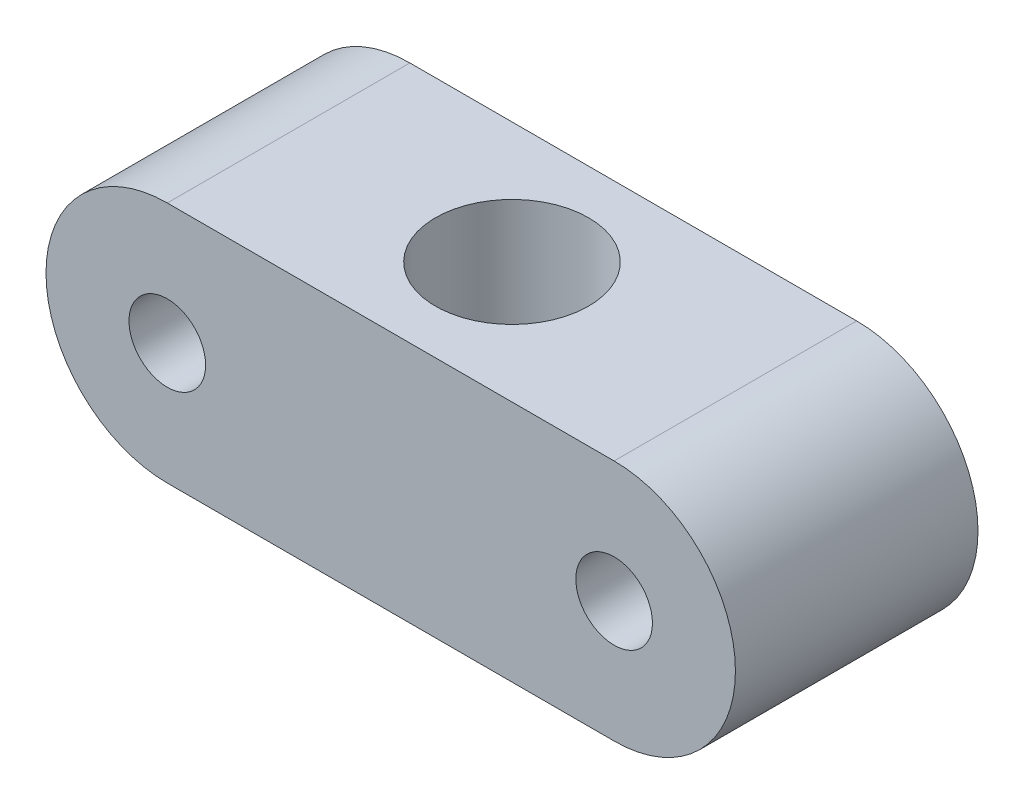
ISO-10303-21;
HEADER;
FILE_DESCRIPTION(('STEP AP214'),'2;1');
FILE_NAME('part.step','',(''),(''),'','','');
FILE_SCHEMA(('AUTOMOTIVE_DESIGN { 1 0 10303 214 1 1 1 1 }'));
ENDSEC;
DATA;
#1=APPLICATION_CONTEXT('core data for automotive mechanical design processes');
#2=APPLICATION_PROTOCOL_DEFINITION('international standard','automotive_design',2000,#1);
#3=PRODUCT_CONTEXT('',#1,'mechanical');
#4=PRODUCT('Part','Part','',(#3));
#5=PRODUCT_RELATED_PRODUCT_CATEGORY('part','',(#4));
#6=PRODUCT_DEFINITION_FORMATION('','',#4);
#7=PRODUCT_DEFINITION_CONTEXT('part definition',#1,'design');
#8=PRODUCT_DEFINITION('design','',#6,#7);
#9=PRODUCT_DEFINITION_SHAPE('','',#8);
#10=(LENGTH_UNIT() NAMED_UNIT(*) SI_UNIT(.MILLI.,.METRE.));
#11=(NAMED_UNIT(*) PLANE_ANGLE_UNIT() SI_UNIT($,.RADIAN.));
#12=(NAMED_UNIT(*) SI_UNIT($,.STERADIAN.) SOLID_ANGLE_UNIT());
#13=UNCERTAINTY_MEASURE_WITH_UNIT(LENGTH_MEASURE(1.E-05),#10,'distance_accuracy_value','');
#14=(GEOMETRIC_REPRESENTATION_CONTEXT(3) GLOBAL_UNCERTAINTY_ASSIGNED_CONTEXT((#13)) GLOBAL_UNIT_ASSIGNED_CONTEXT((#10,
#11,#12)) REPRESENTATION_CONTEXT('',''));
#15=CARTESIAN_POINT('',(0.,0.,0.));
#16=DIRECTION('',(0.,0.,1.));
#17=DIRECTION('',(1.,0.,0.));
#18=AXIS2_PLACEMENT_3D('',#15,#16,#17);
#19=CARTESIAN_POINT('',(0.,0.,19.));
#20=DIRECTION('',(0.,0.,1.));
#21=DIRECTION('',(1.,0.,0.));
#22=AXIS2_PLACEMENT_3D('',#19,#20,#21);
#23=PLANE('',#22);
#24=CARTESIAN_POINT('',(0.,0.,19.));
#25=DIRECTION('',(0.,0.,1.));
#26=DIRECTION('',(1.,0.,0.));
#27=AXIS2_PLACEMENT_3D('',#24,#25,#26);
#28=CIRCLE('',#27,6.);
#29=CARTESIAN_POINT('',(6.00000000000001,0.,19.));
#30=VERTEX_POINT('',#29);
#31=EDGE_CURVE('E102',#30,#30,#28,.T.);
#32=ORIENTED_EDGE('',*,*,#31,.F.);
#33=EDGE_LOOP('',(#32));
#34=FACE_BOUND('',#33,.T.);
#35=CARTESIAN_POINT('',(0.,0.,19.));
#36=DIRECTION('',(0.,0.,1.));
#37=DIRECTION('',(1.,0.,0.));
#38=AXIS2_PLACEMENT_3D('',#35,#36,#37);
#39=CIRCLE('',#38,19.);
#40=CARTESIAN_POINT('',(0.,19.,19.));
#41=VERTEX_POINT('',#40);
#42=CARTESIAN_POINT('',(0.,-19.,19.));
#43=VERTEX_POINT('',#42);
#44=EDGE_CURVE('E87',#41,#43,#39,.T.);
#45=ORIENTED_EDGE('',*,*,#44,.T.);
#46=DIRECTION('',(1.,0.,0.));
#47=VECTOR('',#46,1.);
#48=CARTESIAN_POINT('',(0.,-19.,19.));
#49=LINE('',#48,#47);
#50=CARTESIAN_POINT('',(70.,-19.,19.));
#51=VERTEX_POINT('',#50);
#52=EDGE_CURVE('E82',#43,#51,#49,.T.);
#53=ORIENTED_EDGE('',*,*,#52,.T.);
#54=CARTESIAN_POINT('',(70.,0.,19.));
#55=DIRECTION('',(0.,0.,1.));
#56=DIRECTION('',(1.,0.,0.));
#57=AXIS2_PLACEMENT_3D('',#54,#55,#56);
#58=CIRCLE('',#57,19.);
#59=CARTESIAN_POINT('',(70.,19.,19.));
#60=VERTEX_POINT('',#59);
#61=EDGE_CURVE('E85',#51,#60,#58,.T.);
#62=ORIENTED_EDGE('',*,*,#61,.T.);
#63=DIRECTION('',(-1.,0.,0.));
#64=VECTOR('',#63,1.);
#65=CARTESIAN_POINT('',(0.,19.,19.));
#66=LINE('',#65,#64);
#67=EDGE_CURVE('E52',#60,#41,#66,.T.);
#68=ORIENTED_EDGE('',*,*,#67,.T.);
#69=EDGE_LOOP('',(#45,#53,#62,#68));
#70=FACE_BOUND('',#69,.T.);
#71=CARTESIAN_POINT('',(70.,0.,19.));
#72=DIRECTION('',(0.,0.,1.));
#73=DIRECTION('',(1.,0.,0.));
#74=AXIS2_PLACEMENT_3D('',#71,#72,#73);
#75=CIRCLE('',#74,6.);
#76=CARTESIAN_POINT('',(76.,0.,19.));
#77=VERTEX_POINT('',#76);
#78=EDGE_CURVE('E117',#77,#77,#75,.T.);
#79=ORIENTED_EDGE('',*,*,#78,.F.);
#80=EDGE_LOOP('',(#79));
#81=FACE_BOUND('',#80,.T.);
#82=ADVANCED_FACE('F35',(#34,#70,#81),#23,.T.);
#83=CARTESIAN_POINT('',(0.,0.,-19.));
#84=DIRECTION('',(0.,0.,1.));
#85=DIRECTION('',(1.,0.,0.));
#86=AXIS2_PLACEMENT_3D('',#83,#84,#85);
#87=PLANE('',#86);
#88=CARTESIAN_POINT('',(0.,0.,-19.));
#89=DIRECTION('',(0.,0.,1.));
#90=DIRECTION('',(1.,0.,0.));
#91=AXIS2_PLACEMENT_3D('',#88,#89,#90);
#92=CIRCLE('',#91,19.);
#93=CARTESIAN_POINT('',(0.,19.,-19.));
#94=VERTEX_POINT('',#93);
#95=CARTESIAN_POINT('',(0.,-19.,-19.));
#96=VERTEX_POINT('',#95);
#97=EDGE_CURVE('E99',#94,#96,#92,.T.);
#98=ORIENTED_EDGE('',*,*,#97,.F.);
#99=DIRECTION('',(-1.,0.,0.));
#100=VECTOR('',#99,1.);
#101=CARTESIAN_POINT('',(0.,19.,-19.));
#102=LINE('',#101,#100);
#103=CARTESIAN_POINT('',(70.,19.,-19.));
#104=VERTEX_POINT('',#103);
#105=EDGE_CURVE('E75',#104,#94,#102,.T.);
#106=ORIENTED_EDGE('',*,*,#105,.F.);
#107=CARTESIAN_POINT('',(70.,0.,-19.));
#108=DIRECTION('',(0.,0.,1.));
#109=DIRECTION('',(1.,0.,0.));
#110=AXIS2_PLACEMENT_3D('',#107,#108,#109);
#111=CIRCLE('',#110,19.);
#112=CARTESIAN_POINT('',(70.,-19.,-19.));
#113=VERTEX_POINT('',#112);
#114=EDGE_CURVE('E69',#113,#104,#111,.T.);
#115=ORIENTED_EDGE('',*,*,#114,.F.);
#116=DIRECTION('',(1.,0.,0.));
#117=VECTOR('',#116,1.);
#118=CARTESIAN_POINT('',(0.,-19.,-19.));
#119=LINE('',#118,#117);
#120=EDGE_CURVE('E91',#96,#113,#119,.T.);
#121=ORIENTED_EDGE('',*,*,#120,.F.);
#122=EDGE_LOOP('',(#98,#106,#115,#121));
#123=FACE_BOUND('',#122,.T.);
#124=CARTESIAN_POINT('',(0.,0.,-19.));
#125=DIRECTION('',(0.,0.,1.));
#126=DIRECTION('',(1.,0.,0.));
#127=AXIS2_PLACEMENT_3D('',#124,#125,#126);
#128=CIRCLE('',#127,6.);
#129=CARTESIAN_POINT('',(6.00000000000001,0.,-19.));
#130=VERTEX_POINT('',#129);
#131=EDGE_CURVE('E114',#130,#130,#128,.T.);
#132=ORIENTED_EDGE('',*,*,#131,.T.);
#133=EDGE_LOOP('',(#132));
#134=FACE_BOUND('',#133,.T.);
#135=CARTESIAN_POINT('',(70.,0.,-19.));
#136=DIRECTION('',(0.,0.,1.));
#137=DIRECTION('',(1.,0.,0.));
#138=AXIS2_PLACEMENT_3D('',#135,#136,#137);
#139=CIRCLE('',#138,6.);
#140=CARTESIAN_POINT('',(76.,0.,-19.));
#141=VERTEX_POINT('',#140);
#142=EDGE_CURVE('E120',#141,#141,#139,.T.);
#143=ORIENTED_EDGE('',*,*,#142,.T.);
#144=EDGE_LOOP('',(#143));
#145=FACE_BOUND('',#144,.T.);
#146=ADVANCED_FACE('F110',(#123,#134,#145),#87,.F.);
#147=CARTESIAN_POINT('',(0.,0.,19.));
#148=DIRECTION('',(0.,0.,-1.));
#149=DIRECTION('',(-1.,0.,0.));
#150=AXIS2_PLACEMENT_3D('',#147,#148,#149);
#151=CYLINDRICAL_SURFACE('',#150,19.);
#152=ORIENTED_EDGE('',*,*,#97,.T.);
#153=DIRECTION('',(0.,0.,-1.));
#154=VECTOR('',#153,1.);
#155=CARTESIAN_POINT('',(0.,-19.,19.));
#156=LINE('',#155,#154);
#157=EDGE_CURVE('E11',#43,#96,#156,.T.);
#158=ORIENTED_EDGE('',*,*,#157,.F.);
#159=ORIENTED_EDGE('',*,*,#44,.F.);
#160=DIRECTION('',(0.,0.,-1.));
#161=VECTOR('',#160,1.);
#162=CARTESIAN_POINT('',(0.,19.,19.));
#163=LINE('',#162,#161);
#164=EDGE_CURVE('E95',#41,#94,#163,.T.);
#165=ORIENTED_EDGE('',*,*,#164,.T.);
#166=EDGE_LOOP('',(#152,#158,#159,#165));
#167=FACE_BOUND('',#166,.T.);
#168=ADVANCED_FACE('F37',(#167),#151,.T.);
#169=CARTESIAN_POINT('',(0.,-19.,19.));
#170=DIRECTION('',(0.,1.,0.));
#171=DIRECTION('',(0.,0.,1.));
#172=AXIS2_PLACEMENT_3D('',#169,#170,#171);
#173=PLANE('',#172);
#174=CARTESIAN_POINT('',(35.,-19.,0.));
#175=DIRECTION('',(0.,-1.,0.));
#176=DIRECTION('',(0.,0.,-1.));
#177=AXIS2_PLACEMENT_3D('',#174,#175,#176);
#178=CIRCLE('',#177,12.);
#179=CARTESIAN_POINT('',(35.,-19.,-12.));
#180=VERTEX_POINT('',#179);
#181=EDGE_CURVE('E126',#180,#180,#178,.T.);
#182=ORIENTED_EDGE('',*,*,#181,.F.);
#183=EDGE_LOOP('',(#182));
#184=FACE_BOUND('',#183,.T.);
#185=ORIENTED_EDGE('',*,*,#120,.T.);
#186=DIRECTION('',(0.,0.,-1.));
#187=VECTOR('',#186,1.);
#188=CARTESIAN_POINT('',(70.,-19.,19.));
#189=LINE('',#188,#187);
#190=EDGE_CURVE('E44',#51,#113,#189,.T.);
#191=ORIENTED_EDGE('',*,*,#190,.F.);
#192=ORIENTED_EDGE('',*,*,#52,.F.);
#193=ORIENTED_EDGE('',*,*,#157,.T.);
#194=EDGE_LOOP('',(#185,#191,#192,#193));
#195=FACE_BOUND('',#194,.T.);
#196=ADVANCED_FACE('F90',(#184,#195),#173,.F.);
#197=CARTESIAN_POINT('',(70.,0.,19.));
#198=DIRECTION('',(0.,0.,-1.));
#199=DIRECTION('',(-1.,0.,0.));
#200=AXIS2_PLACEMENT_3D('',#197,#198,#199);
#201=CYLINDRICAL_SURFACE('',#200,19.);
#202=ORIENTED_EDGE('',*,*,#114,.T.);
#203=DIRECTION('',(0.,0.,-1.));
#204=VECTOR('',#203,1.);
#205=CARTESIAN_POINT('',(70.,19.,19.));
#206=LINE('',#205,#204);
#207=EDGE_CURVE('E92',#60,#104,#206,.T.);
#208=ORIENTED_EDGE('',*,*,#207,.F.);
#209=ORIENTED_EDGE('',*,*,#61,.F.);
#210=ORIENTED_EDGE('',*,*,#190,.T.);
#211=EDGE_LOOP('',(#202,#208,#209,#210));
#212=FACE_BOUND('',#211,.T.);
#213=ADVANCED_FACE('F93',(#212),#201,.T.);
#214=CARTESIAN_POINT('',(0.,19.,19.));
#215=DIRECTION('',(0.,-1.,0.));
#216=DIRECTION('',(0.,0.,-1.));
#217=AXIS2_PLACEMENT_3D('',#214,#215,#216);
#218=PLANE('',#217);
#219=CARTESIAN_POINT('',(35.,19.,0.));
#220=DIRECTION('',(0.,-1.,0.));
#221=DIRECTION('',(0.,0.,-1.));
#222=AXIS2_PLACEMENT_3D('',#219,#220,#221);
#223=CIRCLE('',#222,12.);
#224=CARTESIAN_POINT('',(35.,19.,-12.));
#225=VERTEX_POINT('',#224);
#226=EDGE_CURVE('E123',#225,#225,#223,.T.);
#227=ORIENTED_EDGE('',*,*,#226,.T.);
#228=EDGE_LOOP('',(#227));
#229=FACE_BOUND('',#228,.T.);
#230=ORIENTED_EDGE('',*,*,#105,.T.);
#231=ORIENTED_EDGE('',*,*,#164,.F.);
#232=ORIENTED_EDGE('',*,*,#67,.F.);
#233=ORIENTED_EDGE('',*,*,#207,.T.);
#234=EDGE_LOOP('',(#230,#231,#232,#233));
#235=FACE_BOUND('',#234,.T.);
#236=ADVANCED_FACE('F107',(#229,#235),#218,.F.);
#237=CARTESIAN_POINT('',(0.,0.,19.));
#238=DIRECTION('',(0.,0.,-1.));
#239=DIRECTION('',(-1.,0.,0.));
#240=AXIS2_PLACEMENT_3D('',#237,#238,#239);
#241=CYLINDRICAL_SURFACE('',#240,6.);
#242=ORIENTED_EDGE('',*,*,#31,.T.);
#243=EDGE_LOOP('',(#242));
#244=FACE_BOUND('',#243,.T.);
#245=ORIENTED_EDGE('',*,*,#131,.F.);
#246=EDGE_LOOP('',(#245));
#247=FACE_BOUND('',#246,.T.);
#248=ADVANCED_FACE('F155',(#244,#247),#241,.F.);
#249=CARTESIAN_POINT('',(70.,0.,19.));
#250=DIRECTION('',(0.,0.,-1.));
#251=DIRECTION('',(-1.,0.,0.));
#252=AXIS2_PLACEMENT_3D('',#249,#250,#251);
#253=CYLINDRICAL_SURFACE('',#252,6.);
#254=ORIENTED_EDGE('',*,*,#78,.T.);
#255=EDGE_LOOP('',(#254));
#256=FACE_BOUND('',#255,.T.);
#257=ORIENTED_EDGE('',*,*,#142,.F.);
#258=EDGE_LOOP('',(#257));
#259=FACE_BOUND('',#258,.T.);
#260=ADVANCED_FACE('F136',(#256,#259),#253,.F.);
#261=CARTESIAN_POINT('',(35.,19.,0.));
#262=DIRECTION('',(0.,-1.,0.));
#263=DIRECTION('',(0.,0.,-1.));
#264=AXIS2_PLACEMENT_3D('',#261,#262,#263);
#265=CYLINDRICAL_SURFACE('',#264,12.);
#266=ORIENTED_EDGE('',*,*,#226,.F.);
#267=EDGE_LOOP('',(#266));
#268=FACE_BOUND('',#267,.T.);
#269=ORIENTED_EDGE('',*,*,#181,.T.);
#270=EDGE_LOOP('',(#269));
#271=FACE_BOUND('',#270,.T.);
#272=ADVANCED_FACE('F133',(#268,#271),#265,.F.);
#273=CLOSED_SHELL('',(#82,#146,#168,#196,#213,#236,#248,#260,#272));
#274=MANIFOLD_SOLID_BREP('B2',#273);
#275=ADVANCED_BREP_SHAPE_REPRESENTATION('',(#18,#274),#14);
#276=SHAPE_DEFINITION_REPRESENTATION(#9,#275);
ENDSEC;
END-ISO-10303-21;
